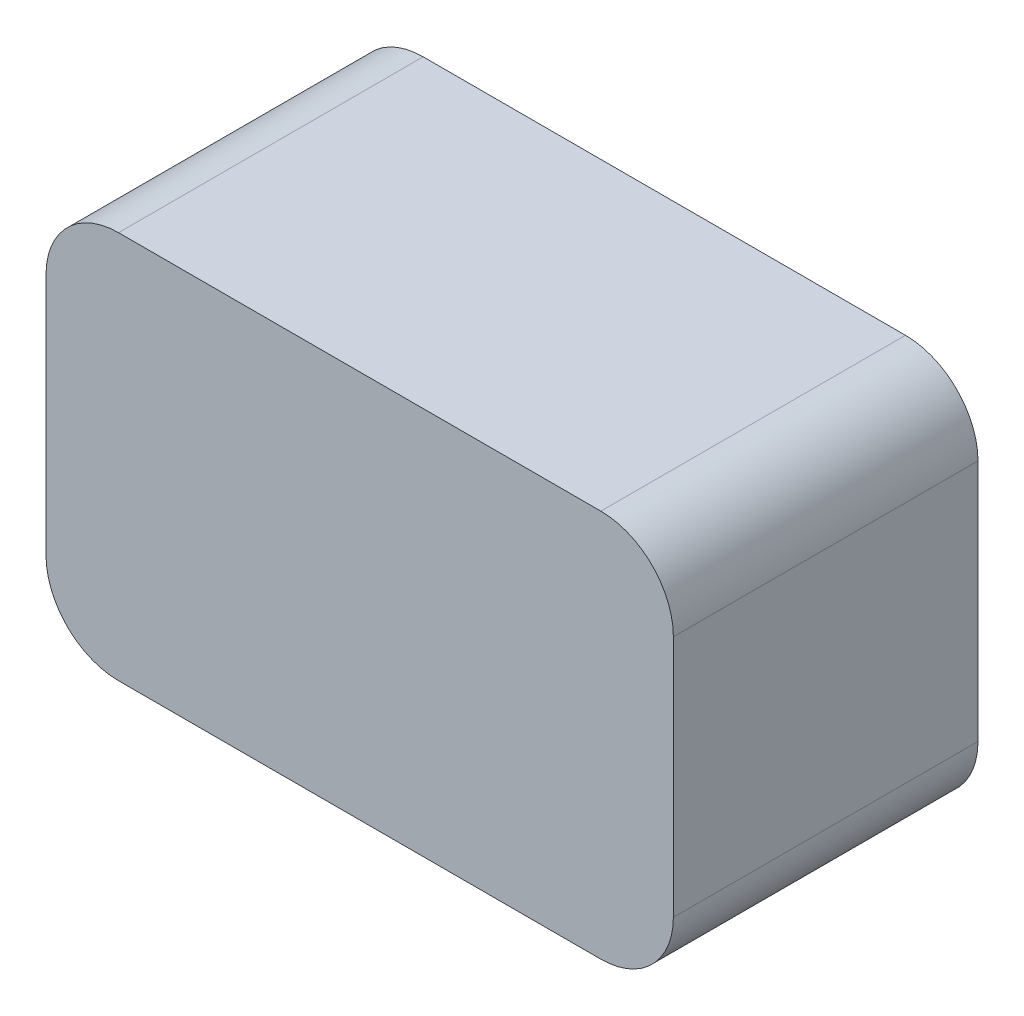
ISO-10303-21;
HEADER;
FILE_DESCRIPTION(('STEP AP214'),'2;1');
FILE_NAME('part.step','',(''),(''),'','','');
FILE_SCHEMA(('AUTOMOTIVE_DESIGN { 1 0 10303 214 1 1 1 1 }'));
ENDSEC;
DATA;
#1=APPLICATION_CONTEXT('core data for automotive mechanical design processes');
#2=APPLICATION_PROTOCOL_DEFINITION('international standard','automotive_design',2000,#1);
#3=PRODUCT_CONTEXT('',#1,'mechanical');
#4=PRODUCT('Part','Part','',(#3));
#5=PRODUCT_RELATED_PRODUCT_CATEGORY('part','',(#4));
#6=PRODUCT_DEFINITION_FORMATION('','',#4);
#7=PRODUCT_DEFINITION_CONTEXT('part definition',#1,'design');
#8=PRODUCT_DEFINITION('design','',#6,#7);
#9=PRODUCT_DEFINITION_SHAPE('','',#8);
#10=(LENGTH_UNIT() NAMED_UNIT(*) SI_UNIT(.MILLI.,.METRE.));
#11=(NAMED_UNIT(*) PLANE_ANGLE_UNIT() SI_UNIT($,.RADIAN.));
#12=(NAMED_UNIT(*) SI_UNIT($,.STERADIAN.) SOLID_ANGLE_UNIT());
#13=UNCERTAINTY_MEASURE_WITH_UNIT(LENGTH_MEASURE(1.E-05),#10,'distance_accuracy_value','');
#14=(GEOMETRIC_REPRESENTATION_CONTEXT(3) GLOBAL_UNCERTAINTY_ASSIGNED_CONTEXT((#13)) GLOBAL_UNIT_ASSIGNED_CONTEXT((#10,
#11,#12)) REPRESENTATION_CONTEXT('',''));
#15=CARTESIAN_POINT('',(0.,0.,0.));
#16=DIRECTION('',(0.,0.,1.));
#17=DIRECTION('',(1.,0.,0.));
#18=AXIS2_PLACEMENT_3D('',#15,#16,#17);
#19=CARTESIAN_POINT('',(24.2648990490756,5.42907303370787,42.));
#20=DIRECTION('',(0.,0.,-1.));
#21=DIRECTION('',(-1.,0.,0.));
#22=AXIS2_PLACEMENT_3D('',#19,#20,#21);
#23=CYLINDRICAL_SURFACE('',#22,10.);
#24=CARTESIAN_POINT('',(24.2648990490756,5.42907303370787,0.));
#25=DIRECTION('',(0.,0.,1.));
#26=DIRECTION('',(-1.,0.,0.));
#27=AXIS2_PLACEMENT_3D('',#24,#25,#26);
#28=CIRCLE('',#27,10.);
#29=CARTESIAN_POINT('',(34.2648990490756,5.4290730337078,0.));
#30=VERTEX_POINT('',#29);
#31=CARTESIAN_POINT('',(24.2648990490755,15.4290730337079,0.));
#32=VERTEX_POINT('',#31);
#33=EDGE_CURVE('E133',#30,#32,#28,.T.);
#34=ORIENTED_EDGE('',*,*,#33,.T.);
#35=DIRECTION('',(0.,0.,-1.));
#36=VECTOR('',#35,1.);
#37=CARTESIAN_POINT('',(24.2648990490755,15.4290730337079,42.));
#38=LINE('',#37,#36);
#39=CARTESIAN_POINT('',(24.2648990490755,15.4290730337079,42.));
#40=VERTEX_POINT('',#39);
#41=EDGE_CURVE('E11',#40,#32,#38,.T.);
#42=ORIENTED_EDGE('',*,*,#41,.F.);
#43=CARTESIAN_POINT('',(24.2648990490756,5.42907303370787,42.));
#44=DIRECTION('',(0.,0.,1.));
#45=DIRECTION('',(-1.,0.,0.));
#46=AXIS2_PLACEMENT_3D('',#43,#44,#45);
#47=CIRCLE('',#46,10.);
#48=CARTESIAN_POINT('',(34.2648990490756,5.4290730337078,42.));
#49=VERTEX_POINT('',#48);
#50=EDGE_CURVE('E147',#49,#40,#47,.T.);
#51=ORIENTED_EDGE('',*,*,#50,.F.);
#52=DIRECTION('',(0.,0.,-1.));
#53=VECTOR('',#52,1.);
#54=CARTESIAN_POINT('',(34.2648990490756,5.4290730337078,42.));
#55=LINE('',#54,#53);
#56=EDGE_CURVE('E129',#49,#30,#55,.T.);
#57=ORIENTED_EDGE('',*,*,#56,.T.);
#58=EDGE_LOOP('',(#34,#42,#51,#57));
#59=FACE_BOUND('',#58,.T.);
#60=ADVANCED_FACE('F37',(#59),#23,.T.);
#61=CARTESIAN_POINT('',(-42.2351009509243,15.4290730337079,42.));
#62=DIRECTION('',(0.,-1.,0.));
#63=DIRECTION('',(0.,0.,-1.));
#64=AXIS2_PLACEMENT_3D('',#61,#62,#63);
#65=PLANE('',#64);
#66=DIRECTION('',(-1.,0.,0.));
#67=VECTOR('',#66,1.);
#68=CARTESIAN_POINT('',(-42.2351009509243,15.4290730337079,0.));
#69=LINE('',#68,#67);
#70=CARTESIAN_POINT('',(-42.2351009509243,15.4290730337079,0.));
#71=VERTEX_POINT('',#70);
#72=EDGE_CURVE('E136',#32,#71,#69,.T.);
#73=ORIENTED_EDGE('',*,*,#72,.T.);
#74=DIRECTION('',(0.,0.,-1.));
#75=VECTOR('',#74,1.);
#76=CARTESIAN_POINT('',(-42.2351009509243,15.4290730337079,42.));
#77=LINE('',#76,#75);
#78=CARTESIAN_POINT('',(-42.2351009509243,15.4290730337079,42.));
#79=VERTEX_POINT('',#78);
#80=EDGE_CURVE('E45',#79,#71,#77,.T.);
#81=ORIENTED_EDGE('',*,*,#80,.F.);
#82=DIRECTION('',(-1.,0.,0.));
#83=VECTOR('',#82,1.);
#84=CARTESIAN_POINT('',(-42.2351009509243,15.4290730337079,42.));
#85=LINE('',#84,#83);
#86=EDGE_CURVE('E96',#40,#79,#85,.T.);
#87=ORIENTED_EDGE('',*,*,#86,.F.);
#88=ORIENTED_EDGE('',*,*,#41,.T.);
#89=EDGE_LOOP('',(#73,#81,#87,#88));
#90=FACE_BOUND('',#89,.T.);
#91=ADVANCED_FACE('F182',(#90),#65,.F.);
#92=CARTESIAN_POINT('',(-42.2351009509244,5.42907303370787,42.));
#93=DIRECTION('',(0.,0.,-1.));
#94=DIRECTION('',(-1.,0.,0.));
#95=AXIS2_PLACEMENT_3D('',#92,#93,#94);
#96=CYLINDRICAL_SURFACE('',#95,10.);
#97=CARTESIAN_POINT('',(-42.2351009509244,5.42907303370787,0.));
#98=DIRECTION('',(0.,0.,1.));
#99=DIRECTION('',(1.,0.,0.));
#100=AXIS2_PLACEMENT_3D('',#97,#98,#99);
#101=CIRCLE('',#100,10.);
#102=CARTESIAN_POINT('',(-52.2351009509244,5.4290730337078,0.));
#103=VERTEX_POINT('',#102);
#104=EDGE_CURVE('E138',#71,#103,#101,.T.);
#105=ORIENTED_EDGE('',*,*,#104,.T.);
#106=DIRECTION('',(0.,0.,-1.));
#107=VECTOR('',#106,1.);
#108=CARTESIAN_POINT('',(-52.2351009509244,5.4290730337078,42.));
#109=LINE('',#108,#107);
#110=CARTESIAN_POINT('',(-52.2351009509244,5.4290730337078,42.));
#111=VERTEX_POINT('',#110);
#112=EDGE_CURVE('E154',#111,#103,#109,.T.);
#113=ORIENTED_EDGE('',*,*,#112,.F.);
#114=CARTESIAN_POINT('',(-42.2351009509244,5.42907303370787,42.));
#115=DIRECTION('',(0.,0.,1.));
#116=DIRECTION('',(1.,0.,0.));
#117=AXIS2_PLACEMENT_3D('',#114,#115,#116);
#118=CIRCLE('',#117,10.);
#119=EDGE_CURVE('E162',#79,#111,#118,.T.);
#120=ORIENTED_EDGE('',*,*,#119,.F.);
#121=ORIENTED_EDGE('',*,*,#80,.T.);
#122=EDGE_LOOP('',(#105,#113,#120,#121));
#123=FACE_BOUND('',#122,.T.);
#124=ADVANCED_FACE('F160',(#123),#96,.T.);
#125=CARTESIAN_POINT('',(-52.2351009509244,5.4290730337078,42.));
#126=DIRECTION('',(1.,0.,0.));
#127=DIRECTION('',(0.,0.,-1.));
#128=AXIS2_PLACEMENT_3D('',#125,#126,#127);
#129=PLANE('',#128);
#130=DIRECTION('',(0.,-1.,0.));
#131=VECTOR('',#130,1.);
#132=CARTESIAN_POINT('',(-52.2351009509244,5.4290730337078,0.));
#133=LINE('',#132,#131);
#134=CARTESIAN_POINT('',(-52.2351009509244,-28.0709269662921,0.));
#135=VERTEX_POINT('',#134);
#136=EDGE_CURVE('E140',#103,#135,#133,.T.);
#137=ORIENTED_EDGE('',*,*,#136,.T.);
#138=DIRECTION('',(0.,0.,-1.));
#139=VECTOR('',#138,1.);
#140=CARTESIAN_POINT('',(-52.2351009509244,-28.0709269662921,42.));
#141=LINE('',#140,#139);
#142=CARTESIAN_POINT('',(-52.2351009509244,-28.0709269662921,42.));
#143=VERTEX_POINT('',#142);
#144=EDGE_CURVE('E151',#143,#135,#141,.T.);
#145=ORIENTED_EDGE('',*,*,#144,.F.);
#146=DIRECTION('',(0.,-1.,0.));
#147=VECTOR('',#146,1.);
#148=CARTESIAN_POINT('',(-52.2351009509244,5.4290730337078,42.));
#149=LINE('',#148,#147);
#150=EDGE_CURVE('E174',#111,#143,#149,.T.);
#151=ORIENTED_EDGE('',*,*,#150,.F.);
#152=ORIENTED_EDGE('',*,*,#112,.T.);
#153=EDGE_LOOP('',(#137,#145,#151,#152));
#154=FACE_BOUND('',#153,.T.);
#155=ADVANCED_FACE('F170',(#154),#129,.F.);
#156=CARTESIAN_POINT('',(-42.2351009509244,-28.0709269662921,42.));
#157=DIRECTION('',(0.,0.,-1.));
#158=DIRECTION('',(-1.,0.,0.));
#159=AXIS2_PLACEMENT_3D('',#156,#157,#158);
#160=CYLINDRICAL_SURFACE('',#159,10.);
#161=CARTESIAN_POINT('',(-42.2351009509244,-28.0709269662921,0.));
#162=DIRECTION('',(0.,0.,1.));
#163=DIRECTION('',(1.,0.,0.));
#164=AXIS2_PLACEMENT_3D('',#161,#162,#163);
#165=CIRCLE('',#164,10.);
#166=CARTESIAN_POINT('',(-42.2351009509243,-38.0709269662921,0.));
#167=VERTEX_POINT('',#166);
#168=EDGE_CURVE('E142',#135,#167,#165,.T.);
#169=ORIENTED_EDGE('',*,*,#168,.T.);
#170=DIRECTION('',(0.,0.,-1.));
#171=VECTOR('',#170,1.);
#172=CARTESIAN_POINT('',(-42.2351009509243,-38.0709269662921,42.));
#173=LINE('',#172,#171);
#174=CARTESIAN_POINT('',(-42.2351009509243,-38.0709269662921,42.));
#175=VERTEX_POINT('',#174);
#176=EDGE_CURVE('E124',#175,#167,#173,.T.);
#177=ORIENTED_EDGE('',*,*,#176,.F.);
#178=CARTESIAN_POINT('',(-42.2351009509244,-28.0709269662921,42.));
#179=DIRECTION('',(0.,0.,1.));
#180=DIRECTION('',(1.,0.,0.));
#181=AXIS2_PLACEMENT_3D('',#178,#179,#180);
#182=CIRCLE('',#181,10.);
#183=EDGE_CURVE('E115',#143,#175,#182,.T.);
#184=ORIENTED_EDGE('',*,*,#183,.F.);
#185=ORIENTED_EDGE('',*,*,#144,.T.);
#186=EDGE_LOOP('',(#169,#177,#184,#185));
#187=FACE_BOUND('',#186,.T.);
#188=ADVANCED_FACE('F173',(#187),#160,.T.);
#189=CARTESIAN_POINT('',(-42.2351009509243,-38.0709269662921,42.));
#190=DIRECTION('',(0.,1.,0.));
#191=DIRECTION('',(0.,0.,1.));
#192=AXIS2_PLACEMENT_3D('',#189,#190,#191);
#193=PLANE('',#192);
#194=DIRECTION('',(1.,0.,0.));
#195=VECTOR('',#194,1.);
#196=CARTESIAN_POINT('',(-42.2351009509243,-38.0709269662921,0.));
#197=LINE('',#196,#195);
#198=CARTESIAN_POINT('',(24.2648990490755,-38.0709269662921,0.));
#199=VERTEX_POINT('',#198);
#200=EDGE_CURVE('E123',#167,#199,#197,.T.);
#201=ORIENTED_EDGE('',*,*,#200,.T.);
#202=DIRECTION('',(0.,0.,-1.));
#203=VECTOR('',#202,1.);
#204=CARTESIAN_POINT('',(24.2648990490755,-38.0709269662921,42.));
#205=LINE('',#204,#203);
#206=CARTESIAN_POINT('',(24.2648990490755,-38.0709269662921,42.));
#207=VERTEX_POINT('',#206);
#208=EDGE_CURVE('E120',#207,#199,#205,.T.);
#209=ORIENTED_EDGE('',*,*,#208,.F.);
#210=DIRECTION('',(1.,0.,0.));
#211=VECTOR('',#210,1.);
#212=CARTESIAN_POINT('',(-42.2351009509243,-38.0709269662921,42.));
#213=LINE('',#212,#211);
#214=EDGE_CURVE('E109',#175,#207,#213,.T.);
#215=ORIENTED_EDGE('',*,*,#214,.F.);
#216=ORIENTED_EDGE('',*,*,#176,.T.);
#217=EDGE_LOOP('',(#201,#209,#215,#216));
#218=FACE_BOUND('',#217,.T.);
#219=ADVANCED_FACE('F121',(#218),#193,.F.);
#220=CARTESIAN_POINT('',(24.2648990490756,-28.0709269662921,42.));
#221=DIRECTION('',(0.,0.,-1.));
#222=DIRECTION('',(-1.,0.,0.));
#223=AXIS2_PLACEMENT_3D('',#220,#221,#222);
#224=CYLINDRICAL_SURFACE('',#223,10.);
#225=CARTESIAN_POINT('',(24.2648990490756,-28.0709269662921,0.));
#226=DIRECTION('',(0.,0.,1.));
#227=DIRECTION('',(1.,0.,0.));
#228=AXIS2_PLACEMENT_3D('',#225,#226,#227);
#229=CIRCLE('',#228,10.);
#230=CARTESIAN_POINT('',(34.2648990490756,-28.0709269662921,0.));
#231=VERTEX_POINT('',#230);
#232=EDGE_CURVE('E82',#199,#231,#229,.T.);
#233=ORIENTED_EDGE('',*,*,#232,.T.);
#234=DIRECTION('',(0.,0.,-1.));
#235=VECTOR('',#234,1.);
#236=CARTESIAN_POINT('',(34.2648990490756,-28.0709269662921,42.));
#237=LINE('',#236,#235);
#238=CARTESIAN_POINT('',(34.2648990490756,-28.0709269662921,42.));
#239=VERTEX_POINT('',#238);
#240=EDGE_CURVE('E125',#239,#231,#237,.T.);
#241=ORIENTED_EDGE('',*,*,#240,.F.);
#242=CARTESIAN_POINT('',(24.2648990490756,-28.0709269662921,42.));
#243=DIRECTION('',(0.,0.,1.));
#244=DIRECTION('',(1.,0.,0.));
#245=AXIS2_PLACEMENT_3D('',#242,#243,#244);
#246=CIRCLE('',#245,10.);
#247=EDGE_CURVE('E113',#207,#239,#246,.T.);
#248=ORIENTED_EDGE('',*,*,#247,.F.);
#249=ORIENTED_EDGE('',*,*,#208,.T.);
#250=EDGE_LOOP('',(#233,#241,#248,#249));
#251=FACE_BOUND('',#250,.T.);
#252=ADVANCED_FACE('F127',(#251),#224,.T.);
#253=CARTESIAN_POINT('',(34.2648990490756,5.4290730337078,42.));
#254=DIRECTION('',(-1.,0.,0.));
#255=DIRECTION('',(0.,-1.,0.));
#256=AXIS2_PLACEMENT_3D('',#253,#254,#255);
#257=PLANE('',#256);
#258=DIRECTION('',(0.,1.,0.));
#259=VECTOR('',#258,1.);
#260=CARTESIAN_POINT('',(34.2648990490756,5.4290730337078,0.));
#261=LINE('',#260,#259);
#262=EDGE_CURVE('E88',#231,#30,#261,.T.);
#263=ORIENTED_EDGE('',*,*,#262,.T.);
#264=ORIENTED_EDGE('',*,*,#56,.F.);
#265=DIRECTION('',(0.,1.,0.));
#266=VECTOR('',#265,1.);
#267=CARTESIAN_POINT('',(34.2648990490756,5.4290730337078,42.));
#268=LINE('',#267,#266);
#269=EDGE_CURVE('E53',#239,#49,#268,.T.);
#270=ORIENTED_EDGE('',*,*,#269,.F.);
#271=ORIENTED_EDGE('',*,*,#240,.T.);
#272=EDGE_LOOP('',(#263,#264,#270,#271));
#273=FACE_BOUND('',#272,.T.);
#274=ADVANCED_FACE('F198',(#273),#257,.F.);
#275=CARTESIAN_POINT('',(24.2648990490756,5.42907303370787,42.));
#276=DIRECTION('',(0.,0.,-1.));
#277=DIRECTION('',(-1.,0.,0.));
#278=AXIS2_PLACEMENT_3D('',#275,#276,#277);
#279=PLANE('',#278);
#280=ORIENTED_EDGE('',*,*,#50,.T.);
#281=ORIENTED_EDGE('',*,*,#86,.T.);
#282=ORIENTED_EDGE('',*,*,#119,.T.);
#283=ORIENTED_EDGE('',*,*,#150,.T.);
#284=ORIENTED_EDGE('',*,*,#183,.T.);
#285=ORIENTED_EDGE('',*,*,#214,.T.);
#286=ORIENTED_EDGE('',*,*,#247,.T.);
#287=ORIENTED_EDGE('',*,*,#269,.T.);
#288=EDGE_LOOP('',(#280,#281,#282,#283,#284,#285,#286,#287));
#289=FACE_BOUND('',#288,.T.);
#290=ADVANCED_FACE('F111',(#289),#279,.F.);
#291=CARTESIAN_POINT('',(24.2648990490756,5.42907303370787,0.));
#292=DIRECTION('',(0.,0.,-1.));
#293=DIRECTION('',(-1.,0.,0.));
#294=AXIS2_PLACEMENT_3D('',#291,#292,#293);
#295=PLANE('',#294);
#296=ORIENTED_EDGE('',*,*,#33,.F.);
#297=ORIENTED_EDGE('',*,*,#262,.F.);
#298=ORIENTED_EDGE('',*,*,#232,.F.);
#299=ORIENTED_EDGE('',*,*,#200,.F.);
#300=ORIENTED_EDGE('',*,*,#168,.F.);
#301=ORIENTED_EDGE('',*,*,#136,.F.);
#302=ORIENTED_EDGE('',*,*,#104,.F.);
#303=ORIENTED_EDGE('',*,*,#72,.F.);
#304=EDGE_LOOP('',(#296,#297,#298,#299,#300,#301,#302,#303));
#305=FACE_BOUND('',#304,.T.);
#306=ADVANCED_FACE('F166',(#305),#295,.T.);
#307=CLOSED_SHELL('',(#60,#91,#124,#155,#188,#219,#252,#274,#290,#306));
#308=MANIFOLD_SOLID_BREP('B2',#307);
#309=ADVANCED_BREP_SHAPE_REPRESENTATION('',(#18,#308),#14);
#310=SHAPE_DEFINITION_REPRESENTATION(#9,#309);
ENDSEC;
END-ISO-10303-21;
